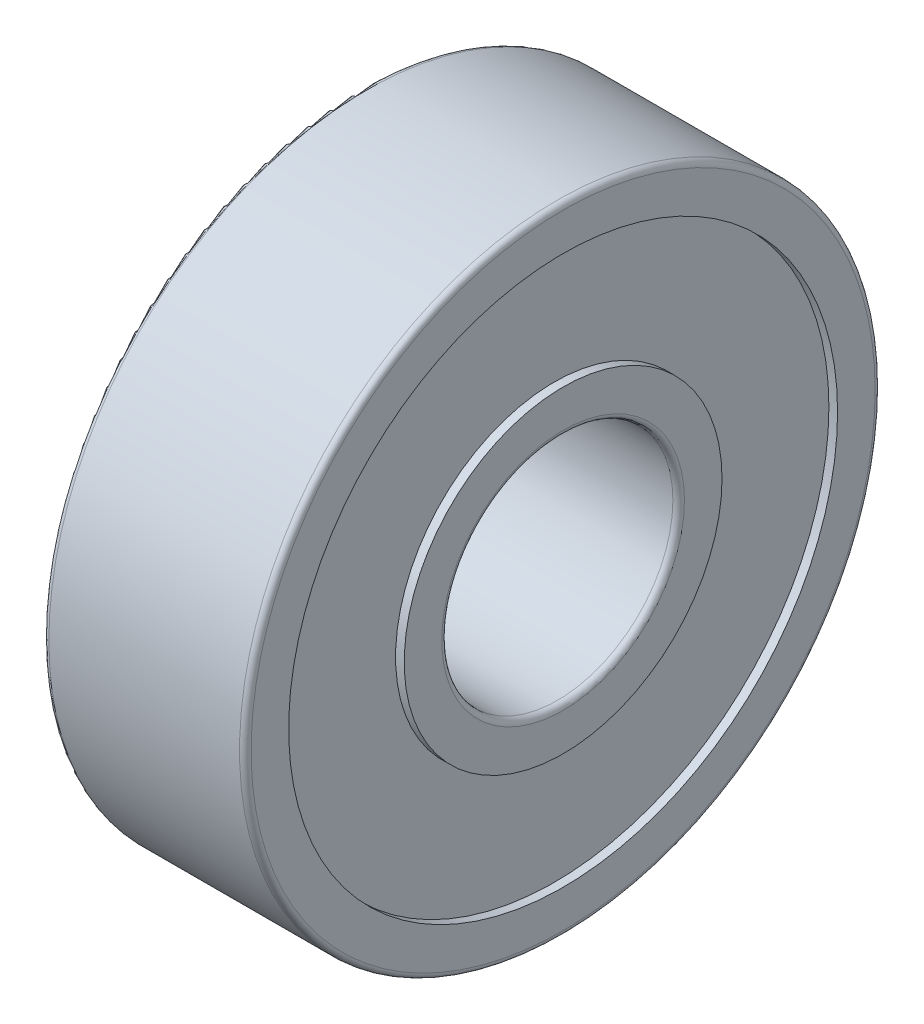
ISO-10303-21;
HEADER;
FILE_DESCRIPTION(('STEP AP214'),'2;1');
FILE_NAME('part.step','',(''),(''),'','','');
FILE_SCHEMA(('AUTOMOTIVE_DESIGN { 1 0 10303 214 1 1 1 1 }'));
ENDSEC;
DATA;
#1=APPLICATION_CONTEXT('core data for automotive mechanical design processes');
#2=APPLICATION_PROTOCOL_DEFINITION('international standard','automotive_design',2000,#1);
#3=PRODUCT_CONTEXT('',#1,'mechanical');
#4=PRODUCT('Part','Part','',(#3));
#5=PRODUCT_RELATED_PRODUCT_CATEGORY('part','',(#4));
#6=PRODUCT_DEFINITION_FORMATION('','',#4);
#7=PRODUCT_DEFINITION_CONTEXT('part definition',#1,'design');
#8=PRODUCT_DEFINITION('design','',#6,#7);
#9=PRODUCT_DEFINITION_SHAPE('','',#8);
#10=(LENGTH_UNIT() NAMED_UNIT(*) SI_UNIT(.MILLI.,.METRE.));
#11=(NAMED_UNIT(*) PLANE_ANGLE_UNIT() SI_UNIT($,.RADIAN.));
#12=(NAMED_UNIT(*) SI_UNIT($,.STERADIAN.) SOLID_ANGLE_UNIT());
#13=UNCERTAINTY_MEASURE_WITH_UNIT(LENGTH_MEASURE(1.E-05),#10,'distance_accuracy_value','');
#14=(GEOMETRIC_REPRESENTATION_CONTEXT(3) GLOBAL_UNCERTAINTY_ASSIGNED_CONTEXT((#13)) GLOBAL_UNIT_ASSIGNED_CONTEXT((#10,
#11,#12)) REPRESENTATION_CONTEXT('',''));
#15=CARTESIAN_POINT('',(0.,0.,0.));
#16=DIRECTION('',(0.,0.,1.));
#17=DIRECTION('',(1.,0.,0.));
#18=AXIS2_PLACEMENT_3D('',#15,#16,#17);
#19=CARTESIAN_POINT('',(-3.5,4.,0.));
#20=DIRECTION('',(-1.,0.,0.));
#21=DIRECTION('',(0.,0.,1.));
#22=AXIS2_PLACEMENT_3D('',#19,#20,#21);
#23=PLANE('',#22);
#24=CARTESIAN_POINT('',(-3.5,0.,0.));
#25=DIRECTION('',(-1.,0.,0.));
#26=DIRECTION('',(0.,0.,1.));
#27=AXIS2_PLACEMENT_3D('',#24,#25,#26);
#28=CIRCLE('',#27,4.2);
#29=CARTESIAN_POINT('',(-3.5,0.,4.2));
#30=VERTEX_POINT('',#29);
#31=EDGE_CURVE('E85',#30,#30,#28,.F.);
#32=ORIENTED_EDGE('',*,*,#31,.T.);
#33=EDGE_LOOP('',(#32));
#34=FACE_BOUND('',#33,.T.);
#35=CARTESIAN_POINT('',(-3.5,0.,0.));
#36=DIRECTION('',(1.,0.,0.));
#37=DIRECTION('',(0.,0.,-1.));
#38=AXIS2_PLACEMENT_3D('',#35,#36,#37);
#39=CIRCLE('',#38,5.5);
#40=CARTESIAN_POINT('',(-3.5,0.,-5.5));
#41=VERTEX_POINT('',#40);
#42=EDGE_CURVE('E89',#41,#41,#39,.T.);
#43=ORIENTED_EDGE('',*,*,#42,.F.);
#44=EDGE_LOOP('',(#43));
#45=FACE_BOUND('',#44,.T.);
#46=ADVANCED_FACE('F47',(#34,#45),#23,.T.);
#47=CARTESIAN_POINT('',(0.,0.,0.));
#48=DIRECTION('',(1.,0.,0.));
#49=DIRECTION('',(0.,0.,-1.));
#50=AXIS2_PLACEMENT_3D('',#47,#48,#49);
#51=CYLINDRICAL_SURFACE('',#50,5.5);
#52=ORIENTED_EDGE('',*,*,#42,.T.);
#53=EDGE_LOOP('',(#52));
#54=FACE_BOUND('',#53,.T.);
#55=CARTESIAN_POINT('',(-3.2,0.,0.));
#56=DIRECTION('',(1.,0.,0.));
#57=DIRECTION('',(0.,0.,-1.));
#58=AXIS2_PLACEMENT_3D('',#55,#56,#57);
#59=CIRCLE('',#58,5.5);
#60=CARTESIAN_POINT('',(-3.2,0.,-5.5));
#61=VERTEX_POINT('',#60);
#62=EDGE_CURVE('E93',#61,#61,#59,.T.);
#63=ORIENTED_EDGE('',*,*,#62,.F.);
#64=EDGE_LOOP('',(#63));
#65=FACE_BOUND('',#64,.T.);
#66=ADVANCED_FACE('F142',(#54,#65),#51,.T.);
#67=CARTESIAN_POINT('',(-3.2,5.5,0.));
#68=DIRECTION('',(-1.,0.,0.));
#69=DIRECTION('',(0.,0.,1.));
#70=AXIS2_PLACEMENT_3D('',#67,#68,#69);
#71=PLANE('',#70);
#72=ORIENTED_EDGE('',*,*,#62,.T.);
#73=EDGE_LOOP('',(#72));
#74=FACE_BOUND('',#73,.T.);
#75=CARTESIAN_POINT('',(-3.2,0.,0.));
#76=DIRECTION('',(1.,0.,0.));
#77=DIRECTION('',(0.,0.,-1.));
#78=AXIS2_PLACEMENT_3D('',#75,#76,#77);
#79=CIRCLE('',#78,9.5);
#80=CARTESIAN_POINT('',(-3.2,0.,-9.5));
#81=VERTEX_POINT('',#80);
#82=EDGE_CURVE('E97',#81,#81,#79,.T.);
#83=ORIENTED_EDGE('',*,*,#82,.F.);
#84=EDGE_LOOP('',(#83));
#85=FACE_BOUND('',#84,.T.);
#86=ADVANCED_FACE('F148',(#74,#85),#71,.T.);
#87=CARTESIAN_POINT('',(0.,0.,0.));
#88=DIRECTION('',(1.,0.,0.));
#89=DIRECTION('',(0.,0.,-1.));
#90=AXIS2_PLACEMENT_3D('',#87,#88,#89);
#91=CYLINDRICAL_SURFACE('',#90,9.5);
#92=ORIENTED_EDGE('',*,*,#82,.T.);
#93=EDGE_LOOP('',(#92));
#94=FACE_BOUND('',#93,.T.);
#95=CARTESIAN_POINT('',(-3.5,0.,0.));
#96=DIRECTION('',(1.,0.,0.));
#97=DIRECTION('',(0.,0.,-1.));
#98=AXIS2_PLACEMENT_3D('',#95,#96,#97);
#99=CIRCLE('',#98,9.5);
#100=CARTESIAN_POINT('',(-3.5,0.,-9.5));
#101=VERTEX_POINT('',#100);
#102=EDGE_CURVE('E101',#101,#101,#99,.T.);
#103=ORIENTED_EDGE('',*,*,#102,.F.);
#104=EDGE_LOOP('',(#103));
#105=FACE_BOUND('',#104,.T.);
#106=ADVANCED_FACE('F184',(#94,#105),#91,.F.);
#107=CARTESIAN_POINT('',(-3.5,9.5,0.));
#108=DIRECTION('',(-1.,0.,0.));
#109=DIRECTION('',(0.,0.,1.));
#110=AXIS2_PLACEMENT_3D('',#107,#108,#109);
#111=PLANE('',#110);
#112=CARTESIAN_POINT('',(-3.5,0.,0.));
#113=DIRECTION('',(-1.,0.,0.));
#114=DIRECTION('',(0.,0.,1.));
#115=AXIS2_PLACEMENT_3D('',#112,#113,#114);
#116=CIRCLE('',#115,10.8);
#117=CARTESIAN_POINT('',(-3.5,0.,10.8));
#118=VERTEX_POINT('',#117);
#119=EDGE_CURVE('E55',#118,#118,#116,.T.);
#120=ORIENTED_EDGE('',*,*,#119,.T.);
#121=EDGE_LOOP('',(#120));
#122=FACE_BOUND('',#121,.T.);
#123=ORIENTED_EDGE('',*,*,#102,.T.);
#124=EDGE_LOOP('',(#123));
#125=FACE_BOUND('',#124,.T.);
#126=ADVANCED_FACE('F175',(#122,#125),#111,.T.);
#127=CARTESIAN_POINT('',(0.,0.,0.));
#128=DIRECTION('',(1.,0.,0.));
#129=DIRECTION('',(0.,0.,-1.));
#130=AXIS2_PLACEMENT_3D('',#127,#128,#129);
#131=CYLINDRICAL_SURFACE('',#130,11.);
#132=CARTESIAN_POINT('',(-3.3,0.,0.));
#133=DIRECTION('',(-1.,0.,0.));
#134=DIRECTION('',(0.,0.,1.));
#135=AXIS2_PLACEMENT_3D('',#132,#133,#134);
#136=CIRCLE('',#135,11.);
#137=CARTESIAN_POINT('',(-3.3,0.,11.));
#138=VERTEX_POINT('',#137);
#139=EDGE_CURVE('E61',#138,#138,#136,.F.);
#140=ORIENTED_EDGE('',*,*,#139,.T.);
#141=EDGE_LOOP('',(#140));
#142=FACE_BOUND('',#141,.T.);
#143=CARTESIAN_POINT('',(3.3,0.,0.));
#144=DIRECTION('',(1.,0.,0.));
#145=DIRECTION('',(0.,0.,-1.));
#146=AXIS2_PLACEMENT_3D('',#143,#144,#145);
#147=CIRCLE('',#146,11.);
#148=CARTESIAN_POINT('',(3.3,0.,-11.));
#149=VERTEX_POINT('',#148);
#150=EDGE_CURVE('E67',#149,#149,#147,.F.);
#151=ORIENTED_EDGE('',*,*,#150,.T.);
#152=EDGE_LOOP('',(#151));
#153=FACE_BOUND('',#152,.T.);
#154=ADVANCED_FACE('F171',(#142,#153),#131,.T.);
#155=CARTESIAN_POINT('',(3.5,9.5,0.));
#156=DIRECTION('',(1.,0.,0.));
#157=DIRECTION('',(0.,0.,-1.));
#158=AXIS2_PLACEMENT_3D('',#155,#156,#157);
#159=PLANE('',#158);
#160=CARTESIAN_POINT('',(3.5,0.,0.));
#161=DIRECTION('',(1.,0.,0.));
#162=DIRECTION('',(0.,0.,-1.));
#163=AXIS2_PLACEMENT_3D('',#160,#161,#162);
#164=CIRCLE('',#163,10.8);
#165=CARTESIAN_POINT('',(3.5,0.,-10.8));
#166=VERTEX_POINT('',#165);
#167=EDGE_CURVE('E10',#166,#166,#164,.T.);
#168=ORIENTED_EDGE('',*,*,#167,.T.);
#169=EDGE_LOOP('',(#168));
#170=FACE_BOUND('',#169,.T.);
#171=CARTESIAN_POINT('',(3.5,0.,0.));
#172=DIRECTION('',(1.,0.,0.));
#173=DIRECTION('',(0.,0.,-1.));
#174=AXIS2_PLACEMENT_3D('',#171,#172,#173);
#175=CIRCLE('',#174,9.5);
#176=CARTESIAN_POINT('',(3.5,0.,-9.5));
#177=VERTEX_POINT('',#176);
#178=EDGE_CURVE('E105',#177,#177,#175,.T.);
#179=ORIENTED_EDGE('',*,*,#178,.F.);
#180=EDGE_LOOP('',(#179));
#181=FACE_BOUND('',#180,.T.);
#182=ADVANCED_FACE('F174',(#170,#181),#159,.T.);
#183=CARTESIAN_POINT('',(0.,0.,0.));
#184=DIRECTION('',(1.,0.,0.));
#185=DIRECTION('',(0.,0.,-1.));
#186=AXIS2_PLACEMENT_3D('',#183,#184,#185);
#187=CYLINDRICAL_SURFACE('',#186,9.5);
#188=ORIENTED_EDGE('',*,*,#178,.T.);
#189=EDGE_LOOP('',(#188));
#190=FACE_BOUND('',#189,.T.);
#191=CARTESIAN_POINT('',(3.2,0.,0.));
#192=DIRECTION('',(1.,0.,0.));
#193=DIRECTION('',(0.,0.,-1.));
#194=AXIS2_PLACEMENT_3D('',#191,#192,#193);
#195=CIRCLE('',#194,9.5);
#196=CARTESIAN_POINT('',(3.2,0.,-9.5));
#197=VERTEX_POINT('',#196);
#198=EDGE_CURVE('E109',#197,#197,#195,.T.);
#199=ORIENTED_EDGE('',*,*,#198,.F.);
#200=EDGE_LOOP('',(#199));
#201=FACE_BOUND('',#200,.T.);
#202=ADVANCED_FACE('F138',(#190,#201),#187,.F.);
#203=CARTESIAN_POINT('',(3.2,5.5,0.));
#204=DIRECTION('',(1.,0.,0.));
#205=DIRECTION('',(0.,0.,-1.));
#206=AXIS2_PLACEMENT_3D('',#203,#204,#205);
#207=PLANE('',#206);
#208=ORIENTED_EDGE('',*,*,#198,.T.);
#209=EDGE_LOOP('',(#208));
#210=FACE_BOUND('',#209,.T.);
#211=CARTESIAN_POINT('',(3.2,0.,0.));
#212=DIRECTION('',(1.,0.,0.));
#213=DIRECTION('',(0.,0.,-1.));
#214=AXIS2_PLACEMENT_3D('',#211,#212,#213);
#215=CIRCLE('',#214,5.5);
#216=CARTESIAN_POINT('',(3.2,0.,-5.5));
#217=VERTEX_POINT('',#216);
#218=EDGE_CURVE('E113',#217,#217,#215,.T.);
#219=ORIENTED_EDGE('',*,*,#218,.F.);
#220=EDGE_LOOP('',(#219));
#221=FACE_BOUND('',#220,.T.);
#222=ADVANCED_FACE('F127',(#210,#221),#207,.T.);
#223=CARTESIAN_POINT('',(0.,0.,0.));
#224=DIRECTION('',(1.,0.,0.));
#225=DIRECTION('',(0.,0.,-1.));
#226=AXIS2_PLACEMENT_3D('',#223,#224,#225);
#227=CYLINDRICAL_SURFACE('',#226,5.5);
#228=ORIENTED_EDGE('',*,*,#218,.T.);
#229=EDGE_LOOP('',(#228));
#230=FACE_BOUND('',#229,.T.);
#231=CARTESIAN_POINT('',(3.5,0.,0.));
#232=DIRECTION('',(1.,0.,0.));
#233=DIRECTION('',(0.,0.,-1.));
#234=AXIS2_PLACEMENT_3D('',#231,#232,#233);
#235=CIRCLE('',#234,5.5);
#236=CARTESIAN_POINT('',(3.5,0.,-5.5));
#237=VERTEX_POINT('',#236);
#238=EDGE_CURVE('E117',#237,#237,#235,.T.);
#239=ORIENTED_EDGE('',*,*,#238,.F.);
#240=EDGE_LOOP('',(#239));
#241=FACE_BOUND('',#240,.T.);
#242=ADVANCED_FACE('F125',(#230,#241),#227,.T.);
#243=CARTESIAN_POINT('',(3.5,4.,0.));
#244=DIRECTION('',(1.,0.,0.));
#245=DIRECTION('',(0.,0.,-1.));
#246=AXIS2_PLACEMENT_3D('',#243,#244,#245);
#247=PLANE('',#246);
#248=CARTESIAN_POINT('',(3.5,0.,0.));
#249=DIRECTION('',(1.,0.,0.));
#250=DIRECTION('',(0.,0.,-1.));
#251=AXIS2_PLACEMENT_3D('',#248,#249,#250);
#252=CIRCLE('',#251,4.2);
#253=CARTESIAN_POINT('',(3.5,0.,-4.2));
#254=VERTEX_POINT('',#253);
#255=EDGE_CURVE('E73',#254,#254,#252,.F.);
#256=ORIENTED_EDGE('',*,*,#255,.T.);
#257=EDGE_LOOP('',(#256));
#258=FACE_BOUND('',#257,.T.);
#259=ORIENTED_EDGE('',*,*,#238,.T.);
#260=EDGE_LOOP('',(#259));
#261=FACE_BOUND('',#260,.T.);
#262=ADVANCED_FACE('F123',(#258,#261),#247,.T.);
#263=CARTESIAN_POINT('',(0.,0.,0.));
#264=DIRECTION('',(1.,0.,0.));
#265=DIRECTION('',(0.,0.,-1.));
#266=AXIS2_PLACEMENT_3D('',#263,#264,#265);
#267=CYLINDRICAL_SURFACE('',#266,4.);
#268=CARTESIAN_POINT('',(-3.3,0.,0.));
#269=DIRECTION('',(-1.,0.,0.));
#270=DIRECTION('',(0.,0.,1.));
#271=AXIS2_PLACEMENT_3D('',#268,#269,#270);
#272=CIRCLE('',#271,4.);
#273=CARTESIAN_POINT('',(-3.3,0.,4.));
#274=VERTEX_POINT('',#273);
#275=EDGE_CURVE('E77',#274,#274,#272,.T.);
#276=ORIENTED_EDGE('',*,*,#275,.T.);
#277=EDGE_LOOP('',(#276));
#278=FACE_BOUND('',#277,.T.);
#279=CARTESIAN_POINT('',(3.3,0.,0.));
#280=DIRECTION('',(1.,0.,0.));
#281=DIRECTION('',(0.,0.,-1.));
#282=AXIS2_PLACEMENT_3D('',#279,#280,#281);
#283=CIRCLE('',#282,4.);
#284=CARTESIAN_POINT('',(3.3,0.,-4.));
#285=VERTEX_POINT('',#284);
#286=EDGE_CURVE('E81',#285,#285,#283,.T.);
#287=ORIENTED_EDGE('',*,*,#286,.T.);
#288=EDGE_LOOP('',(#287));
#289=FACE_BOUND('',#288,.T.);
#290=ADVANCED_FACE('F134',(#278,#289),#267,.F.);
#291=CARTESIAN_POINT('',(-3.3,0.,0.));
#292=DIRECTION('',(-1.,0.,0.));
#293=DIRECTION('',(0.,0.,1.));
#294=AXIS2_PLACEMENT_3D('',#291,#292,#293);
#295=TOROIDAL_SURFACE('',#294,4.2,0.2);
#296=ORIENTED_EDGE('',*,*,#275,.F.);
#297=EDGE_LOOP('',(#296));
#298=FACE_BOUND('',#297,.T.);
#299=ORIENTED_EDGE('',*,*,#31,.F.);
#300=EDGE_LOOP('',(#299));
#301=FACE_BOUND('',#300,.T.);
#302=ADVANCED_FACE('F154',(#298,#301),#295,.T.);
#303=CARTESIAN_POINT('',(3.3,0.,0.));
#304=DIRECTION('',(1.,0.,0.));
#305=DIRECTION('',(0.,0.,-1.));
#306=AXIS2_PLACEMENT_3D('',#303,#304,#305);
#307=TOROIDAL_SURFACE('',#306,4.2,0.2);
#308=ORIENTED_EDGE('',*,*,#255,.F.);
#309=EDGE_LOOP('',(#308));
#310=FACE_BOUND('',#309,.T.);
#311=ORIENTED_EDGE('',*,*,#286,.F.);
#312=EDGE_LOOP('',(#311));
#313=FACE_BOUND('',#312,.T.);
#314=ADVANCED_FACE('F157',(#310,#313),#307,.T.);
#315=CARTESIAN_POINT('',(-3.3,0.,0.));
#316=DIRECTION('',(-1.,0.,0.));
#317=DIRECTION('',(0.,0.,1.));
#318=AXIS2_PLACEMENT_3D('',#315,#316,#317);
#319=TOROIDAL_SURFACE('',#318,10.8,0.2);
#320=ORIENTED_EDGE('',*,*,#119,.F.);
#321=EDGE_LOOP('',(#320));
#322=FACE_BOUND('',#321,.T.);
#323=ORIENTED_EDGE('',*,*,#139,.F.);
#324=EDGE_LOOP('',(#323));
#325=FACE_BOUND('',#324,.T.);
#326=ADVANCED_FACE('F160',(#322,#325),#319,.T.);
#327=CARTESIAN_POINT('',(3.3,0.,0.));
#328=DIRECTION('',(1.,0.,0.));
#329=DIRECTION('',(0.,0.,-1.));
#330=AXIS2_PLACEMENT_3D('',#327,#328,#329);
#331=TOROIDAL_SURFACE('',#330,10.8,0.2);
#332=ORIENTED_EDGE('',*,*,#150,.F.);
#333=EDGE_LOOP('',(#332));
#334=FACE_BOUND('',#333,.T.);
#335=ORIENTED_EDGE('',*,*,#167,.F.);
#336=EDGE_LOOP('',(#335));
#337=FACE_BOUND('',#336,.T.);
#338=ADVANCED_FACE('F49',(#334,#337),#331,.T.);
#339=CLOSED_SHELL('',(#46,#66,#86,#106,#126,#154,#182,#202,#222,#242,#262,#290,#302,#314,#326,#338));
#340=MANIFOLD_SOLID_BREP('B2',#339);
#341=ADVANCED_BREP_SHAPE_REPRESENTATION('',(#18,#340),#14);
#342=SHAPE_DEFINITION_REPRESENTATION(#9,#341);
ENDSEC;
END-ISO-10303-21;
